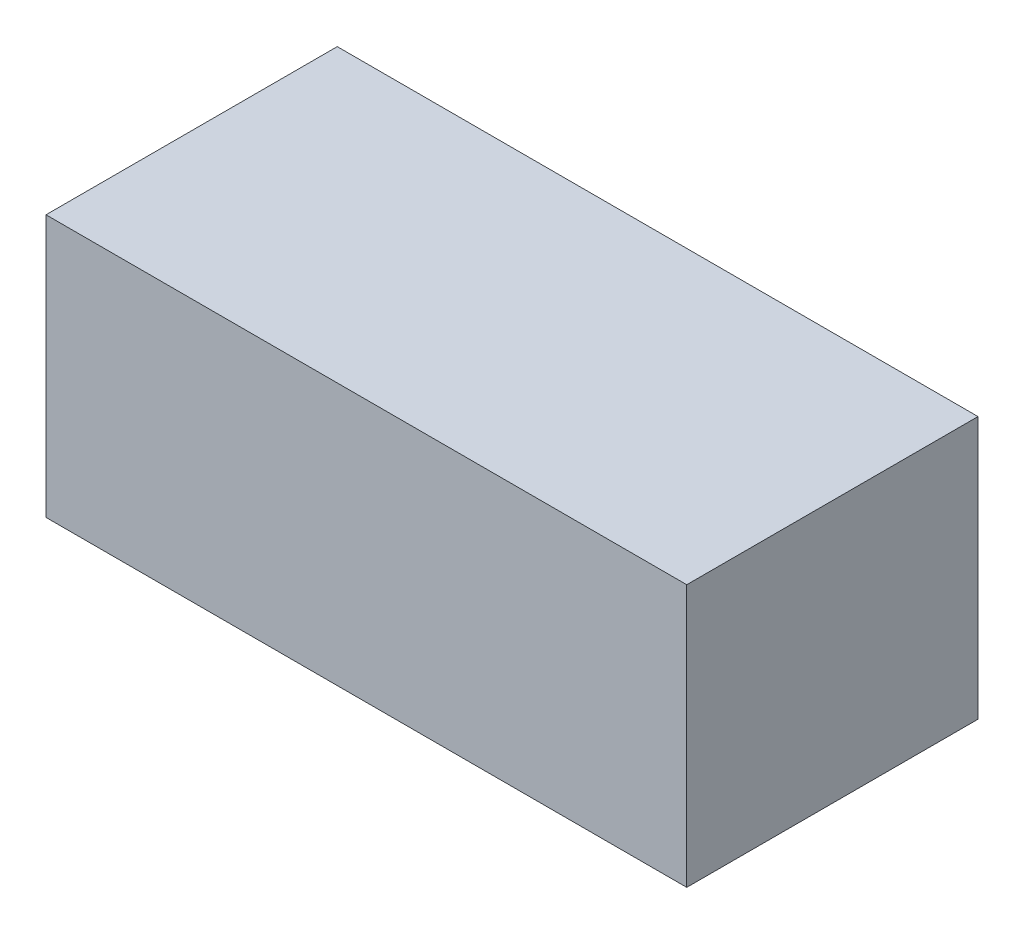
ISO-10303-21;
HEADER;
FILE_DESCRIPTION(('STEP AP214'),'2;1');
FILE_NAME('part.step','',(''),(''),'','','');
FILE_SCHEMA(('AUTOMOTIVE_DESIGN { 1 0 10303 214 1 1 1 1 }'));
ENDSEC;
DATA;
#1=APPLICATION_CONTEXT('core data for automotive mechanical design processes');
#2=APPLICATION_PROTOCOL_DEFINITION('international standard','automotive_design',2000,#1);
#3=PRODUCT_CONTEXT('',#1,'mechanical');
#4=PRODUCT('Part','Part','',(#3));
#5=PRODUCT_RELATED_PRODUCT_CATEGORY('part','',(#4));
#6=PRODUCT_DEFINITION_FORMATION('','',#4);
#7=PRODUCT_DEFINITION_CONTEXT('part definition',#1,'design');
#8=PRODUCT_DEFINITION('design','',#6,#7);
#9=PRODUCT_DEFINITION_SHAPE('','',#8);
#10=(LENGTH_UNIT() NAMED_UNIT(*) SI_UNIT(.MILLI.,.METRE.));
#11=(NAMED_UNIT(*) PLANE_ANGLE_UNIT() SI_UNIT($,.RADIAN.));
#12=(NAMED_UNIT(*) SI_UNIT($,.STERADIAN.) SOLID_ANGLE_UNIT());
#13=UNCERTAINTY_MEASURE_WITH_UNIT(LENGTH_MEASURE(1.E-05),#10,'distance_accuracy_value','');
#14=(GEOMETRIC_REPRESENTATION_CONTEXT(3) GLOBAL_UNCERTAINTY_ASSIGNED_CONTEXT((#13)) GLOBAL_UNIT_ASSIGNED_CONTEXT((#10,
#11,#12)) REPRESENTATION_CONTEXT('',''));
#15=CARTESIAN_POINT('',(0.,0.,0.));
#16=DIRECTION('',(0.,0.,1.));
#17=DIRECTION('',(1.,0.,0.));
#18=AXIS2_PLACEMENT_3D('',#15,#16,#17);
#19=CARTESIAN_POINT('',(11.,9.,-5.));
#20=DIRECTION('',(-1.,0.,0.));
#21=DIRECTION('',(0.,0.,1.));
#22=AXIS2_PLACEMENT_3D('',#19,#20,#21);
#23=PLANE('',#22);
#24=DIRECTION('',(0.,0.,-1.));
#25=VECTOR('',#24,1.);
#26=CARTESIAN_POINT('',(11.,0.,-5.));
#27=LINE('',#26,#25);
#28=CARTESIAN_POINT('',(11.,0.,5.));
#29=VERTEX_POINT('',#28);
#30=CARTESIAN_POINT('',(11.,0.,-5.));
#31=VERTEX_POINT('',#30);
#32=EDGE_CURVE('E96',#29,#31,#27,.T.);
#33=ORIENTED_EDGE('',*,*,#32,.T.);
#34=DIRECTION('',(0.,-1.,0.));
#35=VECTOR('',#34,1.);
#36=CARTESIAN_POINT('',(11.,9.,-5.));
#37=LINE('',#36,#35);
#38=CARTESIAN_POINT('',(11.,9.,-5.));
#39=VERTEX_POINT('',#38);
#40=EDGE_CURVE('E11',#39,#31,#37,.T.);
#41=ORIENTED_EDGE('',*,*,#40,.F.);
#42=DIRECTION('',(0.,0.,-1.));
#43=VECTOR('',#42,1.);
#44=CARTESIAN_POINT('',(11.,9.,-5.));
#45=LINE('',#44,#43);
#46=CARTESIAN_POINT('',(11.,9.,5.));
#47=VERTEX_POINT('',#46);
#48=EDGE_CURVE('E84',#47,#39,#45,.T.);
#49=ORIENTED_EDGE('',*,*,#48,.F.);
#50=DIRECTION('',(0.,-1.,0.));
#51=VECTOR('',#50,1.);
#52=CARTESIAN_POINT('',(11.,9.,5.));
#53=LINE('',#52,#51);
#54=EDGE_CURVE('E92',#47,#29,#53,.T.);
#55=ORIENTED_EDGE('',*,*,#54,.T.);
#56=EDGE_LOOP('',(#33,#41,#49,#55));
#57=FACE_BOUND('',#56,.T.);
#58=ADVANCED_FACE('F33',(#57),#23,.F.);
#59=CARTESIAN_POINT('',(-11.,9.,-5.));
#60=DIRECTION('',(0.,0.,1.));
#61=DIRECTION('',(1.,0.,0.));
#62=AXIS2_PLACEMENT_3D('',#59,#60,#61);
#63=PLANE('',#62);
#64=DIRECTION('',(-1.,0.,0.));
#65=VECTOR('',#64,1.);
#66=CARTESIAN_POINT('',(-11.,0.,-5.));
#67=LINE('',#66,#65);
#68=CARTESIAN_POINT('',(-11.,0.,-5.));
#69=VERTEX_POINT('',#68);
#70=EDGE_CURVE('E88',#31,#69,#67,.T.);
#71=ORIENTED_EDGE('',*,*,#70,.T.);
#72=DIRECTION('',(0.,-1.,0.));
#73=VECTOR('',#72,1.);
#74=CARTESIAN_POINT('',(-11.,9.,-5.));
#75=LINE('',#74,#73);
#76=CARTESIAN_POINT('',(-11.,9.,-5.));
#77=VERTEX_POINT('',#76);
#78=EDGE_CURVE('E41',#77,#69,#75,.T.);
#79=ORIENTED_EDGE('',*,*,#78,.F.);
#80=DIRECTION('',(-1.,0.,0.));
#81=VECTOR('',#80,1.);
#82=CARTESIAN_POINT('',(-11.,9.,-5.));
#83=LINE('',#82,#81);
#84=EDGE_CURVE('E79',#39,#77,#83,.T.);
#85=ORIENTED_EDGE('',*,*,#84,.F.);
#86=ORIENTED_EDGE('',*,*,#40,.T.);
#87=EDGE_LOOP('',(#71,#79,#85,#86));
#88=FACE_BOUND('',#87,.T.);
#89=ADVANCED_FACE('F87',(#88),#63,.F.);
#90=CARTESIAN_POINT('',(-11.,9.,-5.));
#91=DIRECTION('',(1.,0.,0.));
#92=DIRECTION('',(0.,0.,-1.));
#93=AXIS2_PLACEMENT_3D('',#90,#91,#92);
#94=PLANE('',#93);
#95=DIRECTION('',(0.,0.,1.));
#96=VECTOR('',#95,1.);
#97=CARTESIAN_POINT('',(-11.,0.,-5.));
#98=LINE('',#97,#96);
#99=CARTESIAN_POINT('',(-11.,0.,5.));
#100=VERTEX_POINT('',#99);
#101=EDGE_CURVE('E66',#69,#100,#98,.T.);
#102=ORIENTED_EDGE('',*,*,#101,.T.);
#103=DIRECTION('',(0.,-1.,0.));
#104=VECTOR('',#103,1.);
#105=CARTESIAN_POINT('',(-11.,9.,5.));
#106=LINE('',#105,#104);
#107=CARTESIAN_POINT('',(-11.,9.,5.));
#108=VERTEX_POINT('',#107);
#109=EDGE_CURVE('E89',#108,#100,#106,.T.);
#110=ORIENTED_EDGE('',*,*,#109,.F.);
#111=DIRECTION('',(0.,0.,1.));
#112=VECTOR('',#111,1.);
#113=CARTESIAN_POINT('',(-11.,9.,-5.));
#114=LINE('',#113,#112);
#115=EDGE_CURVE('E82',#77,#108,#114,.T.);
#116=ORIENTED_EDGE('',*,*,#115,.F.);
#117=ORIENTED_EDGE('',*,*,#78,.T.);
#118=EDGE_LOOP('',(#102,#110,#116,#117));
#119=FACE_BOUND('',#118,.T.);
#120=ADVANCED_FACE('F90',(#119),#94,.F.);
#121=CARTESIAN_POINT('',(-11.,9.,5.));
#122=DIRECTION('',(0.,0.,-1.));
#123=DIRECTION('',(-1.,0.,0.));
#124=AXIS2_PLACEMENT_3D('',#121,#122,#123);
#125=PLANE('',#124);
#126=DIRECTION('',(1.,0.,0.));
#127=VECTOR('',#126,1.);
#128=CARTESIAN_POINT('',(-11.,0.,5.));
#129=LINE('',#128,#127);
#130=EDGE_CURVE('E72',#100,#29,#129,.T.);
#131=ORIENTED_EDGE('',*,*,#130,.T.);
#132=ORIENTED_EDGE('',*,*,#54,.F.);
#133=DIRECTION('',(1.,0.,0.));
#134=VECTOR('',#133,1.);
#135=CARTESIAN_POINT('',(-11.,9.,5.));
#136=LINE('',#135,#134);
#137=EDGE_CURVE('E49',#108,#47,#136,.T.);
#138=ORIENTED_EDGE('',*,*,#137,.F.);
#139=ORIENTED_EDGE('',*,*,#109,.T.);
#140=EDGE_LOOP('',(#131,#132,#138,#139));
#141=FACE_BOUND('',#140,.T.);
#142=ADVANCED_FACE('F103',(#141),#125,.F.);
#143=CARTESIAN_POINT('',(0.,9.,0.));
#144=DIRECTION('',(0.,1.,0.));
#145=DIRECTION('',(0.,0.,1.));
#146=AXIS2_PLACEMENT_3D('',#143,#144,#145);
#147=PLANE('',#146);
#148=ORIENTED_EDGE('',*,*,#48,.T.);
#149=ORIENTED_EDGE('',*,*,#84,.T.);
#150=ORIENTED_EDGE('',*,*,#115,.T.);
#151=ORIENTED_EDGE('',*,*,#137,.T.);
#152=EDGE_LOOP('',(#148,#149,#150,#151));
#153=FACE_BOUND('',#152,.T.);
#154=ADVANCED_FACE('F80',(#153),#147,.T.);
#155=CARTESIAN_POINT('',(0.,0.,0.));
#156=DIRECTION('',(0.,1.,0.));
#157=DIRECTION('',(0.,0.,1.));
#158=AXIS2_PLACEMENT_3D('',#155,#156,#157);
#159=PLANE('',#158);
#160=ORIENTED_EDGE('',*,*,#32,.F.);
#161=ORIENTED_EDGE('',*,*,#130,.F.);
#162=ORIENTED_EDGE('',*,*,#101,.F.);
#163=ORIENTED_EDGE('',*,*,#70,.F.);
#164=EDGE_LOOP('',(#160,#161,#162,#163));
#165=FACE_BOUND('',#164,.T.);
#166=ADVANCED_FACE('F106',(#165),#159,.F.);
#167=CLOSED_SHELL('',(#58,#89,#120,#142,#154,#166));
#168=MANIFOLD_SOLID_BREP('B2',#167);
#169=ADVANCED_BREP_SHAPE_REPRESENTATION('',(#18,#168),#14);
#170=SHAPE_DEFINITION_REPRESENTATION(#9,#169);
ENDSEC;
END-ISO-10303-21;
